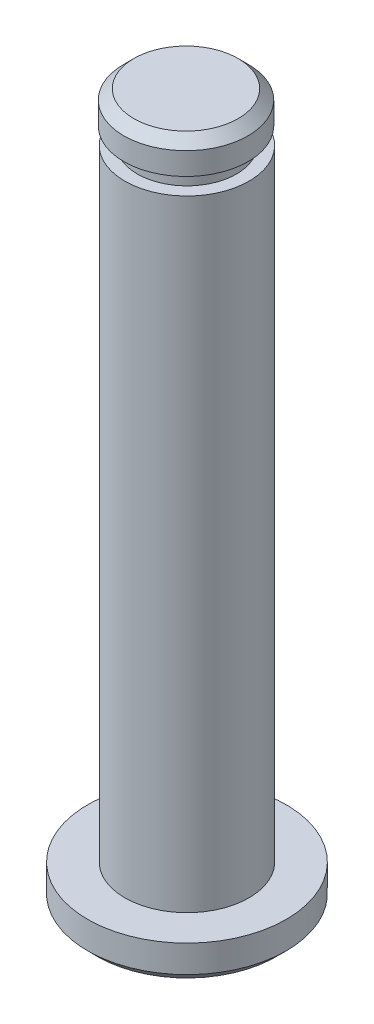
ISO-10303-21;
HEADER;
FILE_DESCRIPTION(('STEP AP214'),'2;1');
FILE_NAME('part.step','',(''),(''),'','','');
FILE_SCHEMA(('AUTOMOTIVE_DESIGN { 1 0 10303 214 1 1 1 1 }'));
ENDSEC;
DATA;
#1=APPLICATION_CONTEXT('core data for automotive mechanical design processes');
#2=APPLICATION_PROTOCOL_DEFINITION('international standard','automotive_design',2000,#1);
#3=PRODUCT_CONTEXT('',#1,'mechanical');
#4=PRODUCT('Part','Part','',(#3));
#5=PRODUCT_RELATED_PRODUCT_CATEGORY('part','',(#4));
#6=PRODUCT_DEFINITION_FORMATION('','',#4);
#7=PRODUCT_DEFINITION_CONTEXT('part definition',#1,'design');
#8=PRODUCT_DEFINITION('design','',#6,#7);
#9=PRODUCT_DEFINITION_SHAPE('','',#8);
#10=(LENGTH_UNIT() NAMED_UNIT(*) SI_UNIT(.MILLI.,.METRE.));
#11=(NAMED_UNIT(*) PLANE_ANGLE_UNIT() SI_UNIT($,.RADIAN.));
#12=(NAMED_UNIT(*) SI_UNIT($,.STERADIAN.) SOLID_ANGLE_UNIT());
#13=UNCERTAINTY_MEASURE_WITH_UNIT(LENGTH_MEASURE(1.E-05),#10,'distance_accuracy_value','');
#14=(GEOMETRIC_REPRESENTATION_CONTEXT(3) GLOBAL_UNCERTAINTY_ASSIGNED_CONTEXT((#13)) GLOBAL_UNIT_ASSIGNED_CONTEXT((#10,
#11,#12)) REPRESENTATION_CONTEXT('',''));
#15=CARTESIAN_POINT('',(0.,0.,0.));
#16=DIRECTION('',(0.,0.,1.));
#17=DIRECTION('',(1.,0.,0.));
#18=AXIS2_PLACEMENT_3D('',#15,#16,#17);
#19=CARTESIAN_POINT('',(0.,28.1,0.038502673796736));
#20=DIRECTION('',(0.,-1.,0.));
#21=DIRECTION('',(0.,0.,1.));
#22=AXIS2_PLACEMENT_3D('',#19,#20,#21);
#23=CONICAL_SURFACE('',#22,2.5,0.785398163397447);
#24=CARTESIAN_POINT('',(0.,28.1,0.038502673796736));
#25=DIRECTION('',(0.,1.,0.));
#26=DIRECTION('',(0.,0.,1.));
#27=AXIS2_PLACEMENT_3D('',#24,#25,#26);
#28=CIRCLE('',#27,2.5);
#29=CARTESIAN_POINT('',(0.,28.1,2.53850267379674));
#30=VERTEX_POINT('',#29);
#31=EDGE_CURVE('E100',#30,#30,#28,.T.);
#32=ORIENTED_EDGE('',*,*,#31,.T.);
#33=EDGE_LOOP('',(#32));
#34=FACE_BOUND('',#33,.T.);
#35=CARTESIAN_POINT('',(0.,28.5,0.038502673796736));
#36=DIRECTION('',(0.,-1.,0.));
#37=DIRECTION('',(0.,0.,1.));
#38=AXIS2_PLACEMENT_3D('',#35,#36,#37);
#39=CIRCLE('',#38,2.1);
#40=CARTESIAN_POINT('',(0.,28.5,2.13850267379674));
#41=VERTEX_POINT('',#40);
#42=EDGE_CURVE('E11',#41,#41,#39,.T.);
#43=ORIENTED_EDGE('',*,*,#42,.T.);
#44=EDGE_LOOP('',(#43));
#45=FACE_BOUND('',#44,.T.);
#46=ADVANCED_FACE('F43',(#34,#45),#23,.T.);
#47=CARTESIAN_POINT('',(0.,0.4,0.));
#48=DIRECTION('',(0.,1.,0.));
#49=DIRECTION('',(0.,0.,-1.));
#50=AXIS2_PLACEMENT_3D('',#47,#48,#49);
#51=CONICAL_SURFACE('',#50,4.,0.785398163397449);
#52=CARTESIAN_POINT('',(0.,0.4,0.));
#53=DIRECTION('',(0.,-1.,0.));
#54=DIRECTION('',(0.,0.,-1.));
#55=AXIS2_PLACEMENT_3D('',#52,#53,#54);
#56=CIRCLE('',#55,4.);
#57=CARTESIAN_POINT('',(0.,0.4,-4.));
#58=VERTEX_POINT('',#57);
#59=EDGE_CURVE('E122',#58,#58,#56,.T.);
#60=ORIENTED_EDGE('',*,*,#59,.T.);
#61=EDGE_LOOP('',(#60));
#62=FACE_BOUND('',#61,.T.);
#63=CARTESIAN_POINT('',(0.,0.,0.));
#64=DIRECTION('',(0.,1.,0.));
#65=DIRECTION('',(0.,0.,-1.));
#66=AXIS2_PLACEMENT_3D('',#63,#64,#65);
#67=CIRCLE('',#66,3.6);
#68=CARTESIAN_POINT('',(0.,0.,-3.6));
#69=VERTEX_POINT('',#68);
#70=EDGE_CURVE('E114',#69,#69,#67,.T.);
#71=ORIENTED_EDGE('',*,*,#70,.T.);
#72=EDGE_LOOP('',(#71));
#73=FACE_BOUND('',#72,.T.);
#74=ADVANCED_FACE('F160',(#62,#73),#51,.T.);
#75=CARTESIAN_POINT('',(0.,27.2,0.038502673796736));
#76=DIRECTION('',(0.,-1.,0.));
#77=DIRECTION('',(0.,0.,1.));
#78=AXIS2_PLACEMENT_3D('',#75,#76,#77);
#79=PLANE('',#78);
#80=CARTESIAN_POINT('',(0.,27.2,0.038502673796736));
#81=DIRECTION('',(0.,1.,0.));
#82=DIRECTION('',(0.,0.,1.));
#83=AXIS2_PLACEMENT_3D('',#80,#81,#82);
#84=CIRCLE('',#83,2.5);
#85=CARTESIAN_POINT('',(0.,27.2,2.53850267379674));
#86=VERTEX_POINT('',#85);
#87=EDGE_CURVE('E53',#86,#86,#84,.T.);
#88=ORIENTED_EDGE('',*,*,#87,.F.);
#89=EDGE_LOOP('',(#88));
#90=FACE_BOUND('',#89,.T.);
#91=CARTESIAN_POINT('',(0.,27.2,0.));
#92=DIRECTION('',(0.,1.,0.));
#93=DIRECTION('',(0.,0.,1.));
#94=AXIS2_PLACEMENT_3D('',#91,#92,#93);
#95=CIRCLE('',#94,2.);
#96=CARTESIAN_POINT('',(0.,27.2,2.));
#97=VERTEX_POINT('',#96);
#98=EDGE_CURVE('E46',#97,#97,#95,.T.);
#99=ORIENTED_EDGE('',*,*,#98,.T.);
#100=EDGE_LOOP('',(#99));
#101=FACE_BOUND('',#100,.T.);
#102=ADVANCED_FACE('F97',(#90,#101),#79,.T.);
#103=CARTESIAN_POINT('',(0.,28.5,0.038502673796736));
#104=DIRECTION('',(0.,-1.,0.));
#105=DIRECTION('',(0.,0.,1.));
#106=AXIS2_PLACEMENT_3D('',#103,#104,#105);
#107=PLANE('',#106);
#108=ORIENTED_EDGE('',*,*,#42,.F.);
#109=EDGE_LOOP('',(#108));
#110=FACE_BOUND('',#109,.T.);
#111=ADVANCED_FACE('F170',(#110),#107,.F.);
#112=CARTESIAN_POINT('',(0.,28.5,0.038502673796736));
#113=DIRECTION('',(0.,-1.,0.));
#114=DIRECTION('',(0.,0.,1.));
#115=AXIS2_PLACEMENT_3D('',#112,#113,#114);
#116=CYLINDRICAL_SURFACE('',#115,2.5);
#117=ORIENTED_EDGE('',*,*,#87,.T.);
#118=EDGE_LOOP('',(#117));
#119=FACE_BOUND('',#118,.T.);
#120=ORIENTED_EDGE('',*,*,#31,.F.);
#121=EDGE_LOOP('',(#120));
#122=FACE_BOUND('',#121,.T.);
#123=ADVANCED_FACE('F156',(#119,#122),#116,.T.);
#124=CARTESIAN_POINT('',(0.,27.2,0.));
#125=DIRECTION('',(0.,-1.,0.));
#126=DIRECTION('',(0.,0.,1.));
#127=AXIS2_PLACEMENT_3D('',#124,#125,#126);
#128=CYLINDRICAL_SURFACE('',#127,2.);
#129=CARTESIAN_POINT('',(0.,26.5,0.));
#130=DIRECTION('',(0.,1.,0.));
#131=DIRECTION('',(0.,0.,1.));
#132=AXIS2_PLACEMENT_3D('',#129,#130,#131);
#133=CIRCLE('',#132,2.);
#134=CARTESIAN_POINT('',(0.,26.5,2.));
#135=VERTEX_POINT('',#134);
#136=EDGE_CURVE('E101',#135,#135,#133,.T.);
#137=ORIENTED_EDGE('',*,*,#136,.T.);
#138=EDGE_LOOP('',(#137));
#139=FACE_BOUND('',#138,.T.);
#140=ORIENTED_EDGE('',*,*,#98,.F.);
#141=EDGE_LOOP('',(#140));
#142=FACE_BOUND('',#141,.T.);
#143=ADVANCED_FACE('F151',(#139,#142),#128,.T.);
#144=CARTESIAN_POINT('',(0.,26.5,0.));
#145=DIRECTION('',(0.,-1.,0.));
#146=DIRECTION('',(0.,0.,1.));
#147=AXIS2_PLACEMENT_3D('',#144,#145,#146);
#148=PLANE('',#147);
#149=CARTESIAN_POINT('',(0.,26.5,0.));
#150=DIRECTION('',(0.,1.,0.));
#151=DIRECTION('',(0.,0.,1.));
#152=AXIS2_PLACEMENT_3D('',#149,#150,#151);
#153=CIRCLE('',#152,2.5);
#154=CARTESIAN_POINT('',(0.,26.5,2.5));
#155=VERTEX_POINT('',#154);
#156=EDGE_CURVE('E107',#155,#155,#153,.T.);
#157=ORIENTED_EDGE('',*,*,#156,.T.);
#158=EDGE_LOOP('',(#157));
#159=FACE_BOUND('',#158,.T.);
#160=ORIENTED_EDGE('',*,*,#136,.F.);
#161=EDGE_LOOP('',(#160));
#162=FACE_BOUND('',#161,.T.);
#163=ADVANCED_FACE('F145',(#159,#162),#148,.F.);
#164=CARTESIAN_POINT('',(0.,26.5,0.));
#165=DIRECTION('',(0.,-1.,0.));
#166=DIRECTION('',(0.,0.,1.));
#167=AXIS2_PLACEMENT_3D('',#164,#165,#166);
#168=CYLINDRICAL_SURFACE('',#167,2.5);
#169=CARTESIAN_POINT('',(0.,1.5,0.));
#170=DIRECTION('',(0.,1.,0.));
#171=DIRECTION('',(0.,0.,1.));
#172=AXIS2_PLACEMENT_3D('',#169,#170,#171);
#173=CIRCLE('',#172,2.5);
#174=CARTESIAN_POINT('',(0.,1.5,2.5));
#175=VERTEX_POINT('',#174);
#176=EDGE_CURVE('E116',#175,#175,#173,.T.);
#177=ORIENTED_EDGE('',*,*,#176,.T.);
#178=EDGE_LOOP('',(#177));
#179=FACE_BOUND('',#178,.T.);
#180=ORIENTED_EDGE('',*,*,#156,.F.);
#181=EDGE_LOOP('',(#180));
#182=FACE_BOUND('',#181,.T.);
#183=ADVANCED_FACE('F142',(#179,#182),#168,.T.);
#184=CARTESIAN_POINT('',(0.,0.,0.));
#185=DIRECTION('',(0.,1.,0.));
#186=DIRECTION('',(1.,0.,0.));
#187=AXIS2_PLACEMENT_3D('',#184,#185,#186);
#188=PLANE('',#187);
#189=ORIENTED_EDGE('',*,*,#70,.F.);
#190=EDGE_LOOP('',(#189));
#191=FACE_BOUND('',#190,.T.);
#192=ADVANCED_FACE('F138',(#191),#188,.F.);
#193=CARTESIAN_POINT('',(0.,1.5,0.));
#194=DIRECTION('',(0.,1.,0.));
#195=DIRECTION('',(1.,0.,0.));
#196=AXIS2_PLACEMENT_3D('',#193,#194,#195);
#197=PLANE('',#196);
#198=CARTESIAN_POINT('',(0.,1.5,0.));
#199=DIRECTION('',(0.,-1.,0.));
#200=DIRECTION('',(1.,0.,0.));
#201=AXIS2_PLACEMENT_3D('',#198,#199,#200);
#202=CIRCLE('',#201,4.);
#203=CARTESIAN_POINT('',(4.,1.5,0.));
#204=VERTEX_POINT('',#203);
#205=EDGE_CURVE('E119',#204,#204,#202,.T.);
#206=ORIENTED_EDGE('',*,*,#205,.F.);
#207=EDGE_LOOP('',(#206));
#208=FACE_BOUND('',#207,.T.);
#209=ORIENTED_EDGE('',*,*,#176,.F.);
#210=EDGE_LOOP('',(#209));
#211=FACE_BOUND('',#210,.T.);
#212=ADVANCED_FACE('F135',(#208,#211),#197,.T.);
#213=CARTESIAN_POINT('',(0.,1.5,0.));
#214=DIRECTION('',(0.,-1.,0.));
#215=DIRECTION('',(0.,0.,1.));
#216=AXIS2_PLACEMENT_3D('',#213,#214,#215);
#217=CYLINDRICAL_SURFACE('',#216,4.);
#218=ORIENTED_EDGE('',*,*,#205,.T.);
#219=EDGE_LOOP('',(#218));
#220=FACE_BOUND('',#219,.T.);
#221=ORIENTED_EDGE('',*,*,#59,.F.);
#222=EDGE_LOOP('',(#221));
#223=FACE_BOUND('',#222,.T.);
#224=ADVANCED_FACE('F132',(#220,#223),#217,.T.);
#225=CLOSED_SHELL('',(#46,#74,#102,#111,#123,#143,#163,#183,#192,#212,#224));
#226=MANIFOLD_SOLID_BREP('B2',#225);
#227=ADVANCED_BREP_SHAPE_REPRESENTATION('',(#18,#226),#14);
#228=SHAPE_DEFINITION_REPRESENTATION(#9,#227);
ENDSEC;
END-ISO-10303-21;
